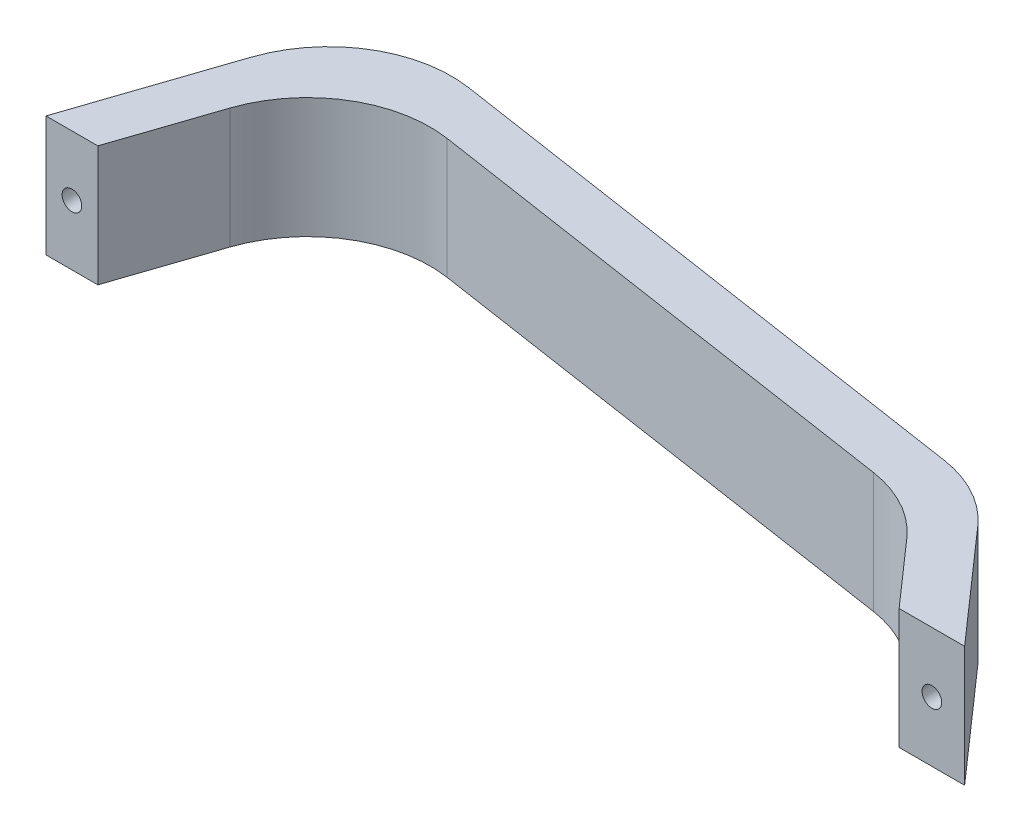
ISO-10303-21;
HEADER;
FILE_DESCRIPTION(('STEP AP214'),'2;1');
FILE_NAME('part.step','',(''),(''),'','','');
FILE_SCHEMA(('AUTOMOTIVE_DESIGN { 1 0 10303 214 1 1 1 1 }'));
ENDSEC;
DATA;
#1=APPLICATION_CONTEXT('core data for automotive mechanical design processes');
#2=APPLICATION_PROTOCOL_DEFINITION('international standard','automotive_design',2000,#1);
#3=PRODUCT_CONTEXT('',#1,'mechanical');
#4=PRODUCT('Part','Part','',(#3));
#5=PRODUCT_RELATED_PRODUCT_CATEGORY('part','',(#4));
#6=PRODUCT_DEFINITION_FORMATION('','',#4);
#7=PRODUCT_DEFINITION_CONTEXT('part definition',#1,'design');
#8=PRODUCT_DEFINITION('design','',#6,#7);
#9=PRODUCT_DEFINITION_SHAPE('','',#8);
#10=(LENGTH_UNIT() NAMED_UNIT(*) SI_UNIT(.MILLI.,.METRE.));
#11=(NAMED_UNIT(*) PLANE_ANGLE_UNIT() SI_UNIT($,.RADIAN.));
#12=(NAMED_UNIT(*) SI_UNIT($,.STERADIAN.) SOLID_ANGLE_UNIT());
#13=UNCERTAINTY_MEASURE_WITH_UNIT(LENGTH_MEASURE(1.E-05),#10,'distance_accuracy_value','');
#14=(GEOMETRIC_REPRESENTATION_CONTEXT(3) GLOBAL_UNCERTAINTY_ASSIGNED_CONTEXT((#13)) GLOBAL_UNIT_ASSIGNED_CONTEXT((#10,
#11,#12)) REPRESENTATION_CONTEXT('',''));
#15=CARTESIAN_POINT('',(0.,0.,0.));
#16=DIRECTION('',(0.,0.,1.));
#17=DIRECTION('',(1.,0.,0.));
#18=AXIS2_PLACEMENT_3D('',#15,#16,#17);
#19=CARTESIAN_POINT('',(-80.,24.5,0.));
#20=DIRECTION('',(0.,0.,-1.));
#21=DIRECTION('',(-1.,0.,0.));
#22=AXIS2_PLACEMENT_3D('',#19,#20,#21);
#23=PLANE('',#22);
#24=CARTESIAN_POINT('',(-85.2761085847183,12.25,0.));
#25=DIRECTION('',(0.,0.,1.));
#26=DIRECTION('',(1.,0.,0.));
#27=AXIS2_PLACEMENT_3D('',#24,#25,#26);
#28=CIRCLE('',#27,2.);
#29=CARTESIAN_POINT('',(-83.2761085847183,12.25,0.));
#30=VERTEX_POINT('',#29);
#31=EDGE_CURVE('E367',#30,#30,#28,.T.);
#32=ORIENTED_EDGE('',*,*,#31,.F.);
#33=EDGE_LOOP('',(#32));
#34=FACE_BOUND('',#33,.T.);
#35=DIRECTION('',(1.,0.,0.));
#36=VECTOR('',#35,1.);
#37=CARTESIAN_POINT('',(-80.,0.,0.));
#38=LINE('',#37,#36);
#39=CARTESIAN_POINT('',(-90.5522171694366,0.,0.));
#40=VERTEX_POINT('',#39);
#41=CARTESIAN_POINT('',(-80.,0.,0.));
#42=VERTEX_POINT('',#41);
#43=EDGE_CURVE('E142',#40,#42,#38,.T.);
#44=ORIENTED_EDGE('',*,*,#43,.T.);
#45=DIRECTION('',(0.,-1.,0.));
#46=VECTOR('',#45,1.);
#47=CARTESIAN_POINT('',(-80.,24.5,0.));
#48=LINE('',#47,#46);
#49=CARTESIAN_POINT('',(-80.,24.5,0.));
#50=VERTEX_POINT('',#49);
#51=EDGE_CURVE('E126',#50,#42,#48,.T.);
#52=ORIENTED_EDGE('',*,*,#51,.F.);
#53=DIRECTION('',(1.,0.,0.));
#54=VECTOR('',#53,1.);
#55=CARTESIAN_POINT('',(-80.,24.5,0.));
#56=LINE('',#55,#54);
#57=CARTESIAN_POINT('',(-90.5522171694366,24.5,0.));
#58=VERTEX_POINT('',#57);
#59=EDGE_CURVE('E130',#58,#50,#56,.T.);
#60=ORIENTED_EDGE('',*,*,#59,.F.);
#61=DIRECTION('',(0.,-1.,0.));
#62=VECTOR('',#61,1.);
#63=CARTESIAN_POINT('',(-90.5522171694366,24.5,0.));
#64=LINE('',#63,#62);
#65=EDGE_CURVE('E206',#58,#40,#64,.T.);
#66=ORIENTED_EDGE('',*,*,#65,.T.);
#67=EDGE_LOOP('',(#44,#52,#60,#66));
#68=FACE_BOUND('',#67,.T.);
#69=ADVANCED_FACE('F34',(#34,#68),#23,.F.);
#70=CARTESIAN_POINT('',(-80.,24.5,0.));
#71=DIRECTION('',(-0.947668138309732,0.,-0.319257105845064));
#72=DIRECTION('',(-0.319257105845064,0.,0.947668138309732));
#73=AXIS2_PLACEMENT_3D('',#70,#71,#72);
#74=PLANE('',#73);
#75=DIRECTION('',(0.319257105845064,0.,-0.947668138309732));
#76=VECTOR('',#75,1.);
#77=CARTESIAN_POINT('',(-80.,0.,0.));
#78=LINE('',#77,#76);
#79=CARTESIAN_POINT('',(-73.2217317390813,0.,-20.120300366646));
#80=VERTEX_POINT('',#79);
#81=EDGE_CURVE('E183',#42,#80,#78,.T.);
#82=ORIENTED_EDGE('',*,*,#81,.T.);
#83=DIRECTION('',(0.,-1.,0.));
#84=VECTOR('',#83,1.);
#85=CARTESIAN_POINT('',(-73.2217317390813,24.5,-20.120300366646));
#86=LINE('',#85,#84);
#87=CARTESIAN_POINT('',(-73.2217317390813,24.5,-20.120300366646));
#88=VERTEX_POINT('',#87);
#89=EDGE_CURVE('E57',#80,#88,#86,.F.);
#90=ORIENTED_EDGE('',*,*,#89,.T.);
#91=DIRECTION('',(0.319257105845064,0.,-0.947668138309732));
#92=VECTOR('',#91,1.);
#93=CARTESIAN_POINT('',(-80.,24.5,0.));
#94=LINE('',#93,#92);
#95=EDGE_CURVE('E122',#50,#88,#94,.T.);
#96=ORIENTED_EDGE('',*,*,#95,.F.);
#97=ORIENTED_EDGE('',*,*,#51,.T.);
#98=EDGE_LOOP('',(#82,#90,#96,#97));
#99=FACE_BOUND('',#98,.T.);
#100=ADVANCED_FACE('F124',(#99),#74,.F.);
#101=CARTESIAN_POINT('',(-66.5245187449483,24.5,-40.));
#102=DIRECTION('',(0.149846027789964,0.,-0.988709344527283));
#103=DIRECTION('',(-0.988709344527283,0.,-0.149846027789964));
#104=AXIS2_PLACEMENT_3D('',#101,#102,#103);
#105=PLANE('',#104);
#106=DIRECTION('',(0.988709344527283,0.,0.149846027789964));
#107=VECTOR('',#106,1.);
#108=CARTESIAN_POINT('',(-66.5245187449483,0.,-40.));
#109=LINE('',#108,#107);
#110=CARTESIAN_POINT('',(-45.7838775865889,0.,-36.8566063337015));
#111=VERTEX_POINT('',#110);
#112=CARTESIAN_POINT('',(56.4423325103516,0.,-21.3634873459643));
#113=VERTEX_POINT('',#112);
#114=EDGE_CURVE('E185',#111,#113,#109,.T.);
#115=ORIENTED_EDGE('',*,*,#114,.T.);
#116=DIRECTION('',(0.,-1.,0.));
#117=VECTOR('',#116,1.);
#118=CARTESIAN_POINT('',(56.4423325103517,24.5,-21.3634873459643));
#119=LINE('',#118,#117);
#120=CARTESIAN_POINT('',(56.4423325103516,24.5,-21.3634873459643));
#121=VERTEX_POINT('',#120);
#122=EDGE_CURVE('E156',#113,#121,#119,.F.);
#123=ORIENTED_EDGE('',*,*,#122,.T.);
#124=DIRECTION('',(0.988709344527283,0.,0.149846027789964));
#125=VECTOR('',#124,1.);
#126=CARTESIAN_POINT('',(-66.5245187449483,24.5,-40.));
#127=LINE('',#126,#125);
#128=CARTESIAN_POINT('',(-45.7838775865889,24.5,-36.8566063337015));
#129=VERTEX_POINT('',#128);
#130=EDGE_CURVE('E129',#129,#121,#127,.T.);
#131=ORIENTED_EDGE('',*,*,#130,.F.);
#132=DIRECTION('',(0.,-1.,0.));
#133=VECTOR('',#132,1.);
#134=CARTESIAN_POINT('',(-45.7838775865889,0.,-36.8566063337015));
#135=LINE('',#134,#133);
#136=EDGE_CURVE('E147',#129,#111,#135,.T.);
#137=ORIENTED_EDGE('',*,*,#136,.T.);
#138=EDGE_LOOP('',(#115,#123,#131,#137));
#139=FACE_BOUND('',#138,.T.);
#140=ADVANCED_FACE('F193',(#139),#105,.F.);
#141=CARTESIAN_POINT('',(65.4388518040712,24.5,-20.));
#142=DIRECTION('',(0.750318833155392,0.,-0.661076129210797));
#143=DIRECTION('',(-0.661076129210797,0.,-0.750318833155392));
#144=AXIS2_PLACEMENT_3D('',#141,#142,#143);
#145=PLANE('',#144);
#146=DIRECTION('',(0.661076129210797,0.,0.750318833155392));
#147=VECTOR('',#146,1.);
#148=CARTESIAN_POINT('',(65.4388518040712,24.5,-20.));
#149=LINE('',#148,#147);
#150=CARTESIAN_POINT('',(71.4541526444874,24.5,-13.1726569630522));
#151=VERTEX_POINT('',#150);
#152=CARTESIAN_POINT('',(83.0600576168243,24.5,0.));
#153=VERTEX_POINT('',#152);
#154=EDGE_CURVE('E195',#151,#153,#149,.T.);
#155=ORIENTED_EDGE('',*,*,#154,.F.);
#156=DIRECTION('',(0.,-1.,0.));
#157=VECTOR('',#156,1.);
#158=CARTESIAN_POINT('',(71.4541526444874,0.,-13.1726569630522));
#159=LINE('',#158,#157);
#160=CARTESIAN_POINT('',(71.4541526444874,0.,-13.1726569630522));
#161=VERTEX_POINT('',#160);
#162=EDGE_CURVE('E143',#151,#161,#159,.T.);
#163=ORIENTED_EDGE('',*,*,#162,.T.);
#164=DIRECTION('',(0.661076129210797,0.,0.750318833155392));
#165=VECTOR('',#164,1.);
#166=CARTESIAN_POINT('',(65.4388518040712,0.,-20.));
#167=LINE('',#166,#165);
#168=CARTESIAN_POINT('',(83.0600576168243,0.,0.));
#169=VERTEX_POINT('',#168);
#170=EDGE_CURVE('E210',#161,#169,#167,.T.);
#171=ORIENTED_EDGE('',*,*,#170,.T.);
#172=DIRECTION('',(0.,-1.,0.));
#173=VECTOR('',#172,1.);
#174=CARTESIAN_POINT('',(83.0600576168243,24.5,0.));
#175=LINE('',#174,#173);
#176=EDGE_CURVE('E144',#153,#169,#175,.T.);
#177=ORIENTED_EDGE('',*,*,#176,.F.);
#178=EDGE_LOOP('',(#155,#163,#171,#177));
#179=FACE_BOUND('',#178,.T.);
#180=ADVANCED_FACE('F327',(#179),#145,.F.);
#181=CARTESIAN_POINT('',(83.0600576168243,24.5,0.));
#182=DIRECTION('',(0.,0.,-1.));
#183=DIRECTION('',(-1.,0.,0.));
#184=AXIS2_PLACEMENT_3D('',#181,#182,#183);
#185=PLANE('',#184);
#186=CARTESIAN_POINT('',(89.7238914152817,12.25,0.));
#187=DIRECTION('',(0.,0.,1.));
#188=DIRECTION('',(1.,0.,0.));
#189=AXIS2_PLACEMENT_3D('',#186,#187,#188);
#190=CIRCLE('',#189,2.);
#191=CARTESIAN_POINT('',(91.7238914152817,12.25,0.));
#192=VERTEX_POINT('',#191);
#193=EDGE_CURVE('E368',#192,#192,#190,.T.);
#194=ORIENTED_EDGE('',*,*,#193,.F.);
#195=EDGE_LOOP('',(#194));
#196=FACE_BOUND('',#195,.T.);
#197=DIRECTION('',(1.,0.,0.));
#198=VECTOR('',#197,1.);
#199=CARTESIAN_POINT('',(83.0600576168243,0.,0.));
#200=LINE('',#199,#198);
#201=CARTESIAN_POINT('',(96.3877252137391,0.,0.));
#202=VERTEX_POINT('',#201);
#203=EDGE_CURVE('E212',#169,#202,#200,.T.);
#204=ORIENTED_EDGE('',*,*,#203,.T.);
#205=DIRECTION('',(0.,-1.,0.));
#206=VECTOR('',#205,1.);
#207=CARTESIAN_POINT('',(96.3877252137391,24.5,0.));
#208=LINE('',#207,#206);
#209=CARTESIAN_POINT('',(96.3877252137391,24.5,0.));
#210=VERTEX_POINT('',#209);
#211=EDGE_CURVE('E150',#210,#202,#208,.T.);
#212=ORIENTED_EDGE('',*,*,#211,.F.);
#213=DIRECTION('',(1.,0.,0.));
#214=VECTOR('',#213,1.);
#215=CARTESIAN_POINT('',(83.0600576168243,24.5,0.));
#216=LINE('',#215,#214);
#217=EDGE_CURVE('E197',#153,#210,#216,.T.);
#218=ORIENTED_EDGE('',*,*,#217,.F.);
#219=ORIENTED_EDGE('',*,*,#176,.T.);
#220=EDGE_LOOP('',(#204,#212,#218,#219));
#221=FACE_BOUND('',#220,.T.);
#222=ADVANCED_FACE('F230',(#196,#221),#185,.F.);
#223=CARTESIAN_POINT('',(70.5359197994586,24.5,-29.3416985068871));
#224=DIRECTION('',(-0.750318833155392,0.,0.661076129210798));
#225=DIRECTION('',(0.661076129210797,0.,0.750318833155392));
#226=AXIS2_PLACEMENT_3D('',#223,#224,#225);
#227=PLANE('',#226);
#228=DIRECTION('',(-0.661076129210797,0.,-0.750318833155392));
#229=VECTOR('',#228,1.);
#230=CARTESIAN_POINT('',(70.5359197994586,0.,-29.3416985068871));
#231=LINE('',#230,#229);
#232=CARTESIAN_POINT('',(76.5512206398748,0.,-22.5143554699393));
#233=VERTEX_POINT('',#232);
#234=EDGE_CURVE('E215',#202,#233,#231,.T.);
#235=ORIENTED_EDGE('',*,*,#234,.T.);
#236=DIRECTION('',(0.,-1.,0.));
#237=VECTOR('',#236,1.);
#238=CARTESIAN_POINT('',(76.5512206398748,24.5,-22.5143554699393));
#239=LINE('',#238,#237);
#240=CARTESIAN_POINT('',(76.5512206398748,24.5,-22.5143554699392));
#241=VERTEX_POINT('',#240);
#242=EDGE_CURVE('E167',#233,#241,#239,.F.);
#243=ORIENTED_EDGE('',*,*,#242,.T.);
#244=DIRECTION('',(-0.661076129210799,0.,-0.750318833155391));
#245=VECTOR('',#244,1.);
#246=CARTESIAN_POINT('',(90.5632459483782,24.5,-6.61076129210796));
#247=LINE('',#246,#245);
#248=EDGE_CURVE('E201',#210,#241,#247,.T.);
#249=ORIENTED_EDGE('',*,*,#248,.F.);
#250=ORIENTED_EDGE('',*,*,#211,.T.);
#251=EDGE_LOOP('',(#235,#243,#249,#250));
#252=FACE_BOUND('',#251,.T.);
#253=ADVANCED_FACE('F226',(#252),#227,.F.);
#254=CARTESIAN_POINT('',(-73.3223149303924,24.5,-51.1444509117922));
#255=DIRECTION('',(-0.149846027789964,0.,0.988709344527283));
#256=DIRECTION('',(0.988709344527283,0.,0.149846027789964));
#257=AXIS2_PLACEMENT_3D('',#254,#255,#256);
#258=PLANE('',#257);
#259=DIRECTION('',(-0.988709344527283,0.,-0.149846027789964));
#260=VECTOR('',#259,1.);
#261=CARTESIAN_POINT('',(-73.3223149303924,24.5,-51.1444509117922));
#262=LINE('',#261,#260);
#263=CARTESIAN_POINT('',(61.5394005057391,24.5,-30.7051858528514));
#264=VERTEX_POINT('',#263);
#265=CARTESIAN_POINT('',(-52.5816737720328,24.5,-48.0010572454937));
#266=VERTEX_POINT('',#265);
#267=EDGE_CURVE('E203',#264,#266,#262,.T.);
#268=ORIENTED_EDGE('',*,*,#267,.F.);
#269=DIRECTION('',(0.,-1.,0.));
#270=VECTOR('',#269,1.);
#271=CARTESIAN_POINT('',(61.5394005057391,24.5,-30.7051858528514));
#272=LINE('',#271,#270);
#273=CARTESIAN_POINT('',(61.5394005057391,0.,-30.7051858528514));
#274=VERTEX_POINT('',#273);
#275=EDGE_CURVE('E160',#264,#274,#272,.T.);
#276=ORIENTED_EDGE('',*,*,#275,.T.);
#277=DIRECTION('',(-0.988709344527283,0.,-0.149846027789964));
#278=VECTOR('',#277,1.);
#279=CARTESIAN_POINT('',(-73.3223149303924,0.,-51.1444509117922));
#280=LINE('',#279,#278);
#281=CARTESIAN_POINT('',(-52.5816737720328,0.,-48.0010572454937));
#282=VERTEX_POINT('',#281);
#283=EDGE_CURVE('E218',#274,#282,#280,.T.);
#284=ORIENTED_EDGE('',*,*,#283,.T.);
#285=DIRECTION('',(0.,-1.,0.));
#286=VECTOR('',#285,1.);
#287=CARTESIAN_POINT('',(-52.5816737720328,24.5,-48.0010572454937));
#288=LINE('',#287,#286);
#289=EDGE_CURVE('E158',#282,#266,#288,.F.);
#290=ORIENTED_EDGE('',*,*,#289,.T.);
#291=EDGE_LOOP('',(#268,#276,#284,#290));
#292=FACE_BOUND('',#291,.T.);
#293=ADVANCED_FACE('F240',(#292),#258,.F.);
#294=CARTESIAN_POINT('',(-89.4766813830973,24.5,-3.19257105845063));
#295=DIRECTION('',(0.94766813830973,0.,0.319257105845071));
#296=DIRECTION('',(0.319257105845071,0.,-0.94766813830973));
#297=AXIS2_PLACEMENT_3D('',#294,#295,#296);
#298=PLANE('',#297);
#299=DIRECTION('',(-0.319257105845063,0.,0.947668138309732));
#300=VECTOR('',#299,1.);
#301=CARTESIAN_POINT('',(-89.4766813830973,24.5,-3.19257105845063));
#302=LINE('',#301,#300);
#303=CARTESIAN_POINT('',(-80.0195279245253,24.5,-31.2647512784385));
#304=VERTEX_POINT('',#303);
#305=EDGE_CURVE('E135',#304,#58,#302,.T.);
#306=ORIENTED_EDGE('',*,*,#305,.F.);
#307=DIRECTION('',(0.,-1.,0.));
#308=VECTOR('',#307,1.);
#309=CARTESIAN_POINT('',(-80.0195279245251,24.5,-31.2647512784384));
#310=LINE('',#309,#308);
#311=CARTESIAN_POINT('',(-80.0195279245251,0.,-31.2647512784384));
#312=VERTEX_POINT('',#311);
#313=EDGE_CURVE('E172',#304,#312,#310,.T.);
#314=ORIENTED_EDGE('',*,*,#313,.T.);
#315=DIRECTION('',(-0.319257105845071,0.,0.94766813830973));
#316=VECTOR('',#315,1.);
#317=CARTESIAN_POINT('',(-89.4766813830973,0.,-3.19257105845063));
#318=LINE('',#317,#316);
#319=EDGE_CURVE('E139',#312,#40,#318,.T.);
#320=ORIENTED_EDGE('',*,*,#319,.T.);
#321=ORIENTED_EDGE('',*,*,#65,.F.);
#322=EDGE_LOOP('',(#306,#314,#320,#321));
#323=FACE_BOUND('',#322,.T.);
#324=ADVANCED_FACE('F247',(#323),#298,.F.);
#325=CARTESIAN_POINT('',(0.,24.5,0.));
#326=DIRECTION('',(0.,1.,0.));
#327=DIRECTION('',(0.,0.,1.));
#328=AXIS2_PLACEMENT_3D('',#325,#326,#327);
#329=PLANE('',#328);
#330=ORIENTED_EDGE('',*,*,#248,.T.);
#331=CARTESIAN_POINT('',(57.79324981099,24.5,-5.98745223966934));
#332=DIRECTION('',(0.,1.,0.));
#333=DIRECTION('',(0.,0.,1.));
#334=AXIS2_PLACEMENT_3D('',#331,#332,#333);
#335=CIRCLE('',#334,25.);
#336=EDGE_CURVE('E170',#241,#264,#335,.T.);
#337=ORIENTED_EDGE('',*,*,#336,.T.);
#338=ORIENTED_EDGE('',*,*,#267,.T.);
#339=CARTESIAN_POINT('',(-56.3278244667819,24.5,-23.2833236323116));
#340=DIRECTION('',(0.,1.,0.));
#341=DIRECTION('',(0.,0.,1.));
#342=AXIS2_PLACEMENT_3D('',#339,#340,#341);
#343=CIRCLE('',#342,25.);
#344=EDGE_CURVE('E49',#266,#304,#343,.T.);
#345=ORIENTED_EDGE('',*,*,#344,.T.);
#346=ORIENTED_EDGE('',*,*,#305,.T.);
#347=ORIENTED_EDGE('',*,*,#59,.T.);
#348=ORIENTED_EDGE('',*,*,#95,.T.);
#349=CARTESIAN_POINT('',(-49.530028281338,24.5,-12.1388727205194));
#350=DIRECTION('',(0.,1.,0.));
#351=DIRECTION('',(0.,0.,1.));
#352=AXIS2_PLACEMENT_3D('',#349,#350,#351);
#353=CIRCLE('',#352,25.);
#354=EDGE_CURVE('E11',#88,#129,#353,.F.);
#355=ORIENTED_EDGE('',*,*,#354,.T.);
#356=ORIENTED_EDGE('',*,*,#130,.T.);
#357=CARTESIAN_POINT('',(52.6961818156026,24.5,3.35424626721774));
#358=DIRECTION('',(0.,1.,0.));
#359=DIRECTION('',(0.,0.,1.));
#360=AXIS2_PLACEMENT_3D('',#357,#358,#359);
#361=CIRCLE('',#360,25.);
#362=EDGE_CURVE('E178',#121,#151,#361,.F.);
#363=ORIENTED_EDGE('',*,*,#362,.T.);
#364=ORIENTED_EDGE('',*,*,#154,.T.);
#365=ORIENTED_EDGE('',*,*,#217,.T.);
#366=EDGE_LOOP('',(#330,#337,#338,#345,#346,#347,#348,#355,#356,#363,#364,#365));
#367=FACE_BOUND('',#366,.T.);
#368=ADVANCED_FACE('F134',(#367),#329,.T.);
#369=CARTESIAN_POINT('',(0.,0.,0.));
#370=DIRECTION('',(0.,1.,0.));
#371=DIRECTION('',(0.,0.,1.));
#372=AXIS2_PLACEMENT_3D('',#369,#370,#371);
#373=PLANE('',#372);
#374=ORIENTED_EDGE('',*,*,#283,.F.);
#375=CARTESIAN_POINT('',(57.79324981099,0.,-5.98745223966934));
#376=DIRECTION('',(0.,1.,0.));
#377=DIRECTION('',(0.,0.,1.));
#378=AXIS2_PLACEMENT_3D('',#375,#376,#377);
#379=CIRCLE('',#378,25.);
#380=EDGE_CURVE('E165',#274,#233,#379,.F.);
#381=ORIENTED_EDGE('',*,*,#380,.T.);
#382=ORIENTED_EDGE('',*,*,#234,.F.);
#383=ORIENTED_EDGE('',*,*,#203,.F.);
#384=ORIENTED_EDGE('',*,*,#170,.F.);
#385=CARTESIAN_POINT('',(52.6961818156026,0.,3.35424626721774));
#386=DIRECTION('',(0.,1.,0.));
#387=DIRECTION('',(0.,0.,1.));
#388=AXIS2_PLACEMENT_3D('',#385,#386,#387);
#389=CIRCLE('',#388,25.);
#390=EDGE_CURVE('E176',#161,#113,#389,.T.);
#391=ORIENTED_EDGE('',*,*,#390,.T.);
#392=ORIENTED_EDGE('',*,*,#114,.F.);
#393=CARTESIAN_POINT('',(-49.530028281338,0.,-12.1388727205194));
#394=DIRECTION('',(0.,1.,0.));
#395=DIRECTION('',(0.,0.,1.));
#396=AXIS2_PLACEMENT_3D('',#393,#394,#395);
#397=CIRCLE('',#396,25.);
#398=EDGE_CURVE('E42',#111,#80,#397,.T.);
#399=ORIENTED_EDGE('',*,*,#398,.T.);
#400=ORIENTED_EDGE('',*,*,#81,.F.);
#401=ORIENTED_EDGE('',*,*,#43,.F.);
#402=ORIENTED_EDGE('',*,*,#319,.F.);
#403=CARTESIAN_POINT('',(-56.3278244667819,0.,-23.2833236323116));
#404=DIRECTION('',(0.,1.,0.));
#405=DIRECTION('',(0.,0.,1.));
#406=AXIS2_PLACEMENT_3D('',#403,#404,#405);
#407=CIRCLE('',#406,25.);
#408=EDGE_CURVE('E163',#312,#282,#407,.F.);
#409=ORIENTED_EDGE('',*,*,#408,.T.);
#410=EDGE_LOOP('',(#374,#381,#382,#383,#384,#391,#392,#399,#400,#401,#402,#409));
#411=FACE_BOUND('',#410,.T.);
#412=ADVANCED_FACE('F182',(#411),#373,.F.);
#413=CARTESIAN_POINT('',(52.6961818156026,24.5,3.35424626721774));
#414=DIRECTION('',(0.,1.,0.));
#415=DIRECTION('',(0.,0.,1.));
#416=AXIS2_PLACEMENT_3D('',#413,#414,#415);
#417=CYLINDRICAL_SURFACE('',#416,25.);
#418=ORIENTED_EDGE('',*,*,#362,.F.);
#419=ORIENTED_EDGE('',*,*,#122,.F.);
#420=ORIENTED_EDGE('',*,*,#390,.F.);
#421=ORIENTED_EDGE('',*,*,#162,.F.);
#422=EDGE_LOOP('',(#418,#419,#420,#421));
#423=FACE_BOUND('',#422,.T.);
#424=ADVANCED_FACE('F267',(#423),#417,.F.);
#425=CARTESIAN_POINT('',(57.79324981099,24.5,-5.98745223966934));
#426=DIRECTION('',(0.,-1.,0.));
#427=DIRECTION('',(0.,0.,-1.));
#428=AXIS2_PLACEMENT_3D('',#425,#426,#427);
#429=CYLINDRICAL_SURFACE('',#428,25.);
#430=ORIENTED_EDGE('',*,*,#336,.F.);
#431=ORIENTED_EDGE('',*,*,#242,.F.);
#432=ORIENTED_EDGE('',*,*,#380,.F.);
#433=ORIENTED_EDGE('',*,*,#275,.F.);
#434=EDGE_LOOP('',(#430,#431,#432,#433));
#435=FACE_BOUND('',#434,.T.);
#436=ADVANCED_FACE('F237',(#435),#429,.T.);
#437=CARTESIAN_POINT('',(-56.3278244667819,24.5,-23.2833236323116));
#438=DIRECTION('',(0.,-1.,0.));
#439=DIRECTION('',(0.,0.,-1.));
#440=AXIS2_PLACEMENT_3D('',#437,#438,#439);
#441=CYLINDRICAL_SURFACE('',#440,25.);
#442=ORIENTED_EDGE('',*,*,#344,.F.);
#443=ORIENTED_EDGE('',*,*,#289,.F.);
#444=ORIENTED_EDGE('',*,*,#408,.F.);
#445=ORIENTED_EDGE('',*,*,#313,.F.);
#446=EDGE_LOOP('',(#442,#443,#444,#445));
#447=FACE_BOUND('',#446,.T.);
#448=ADVANCED_FACE('F244',(#447),#441,.T.);
#449=CARTESIAN_POINT('',(-49.530028281338,24.5,-12.1388727205194));
#450=DIRECTION('',(0.,1.,0.));
#451=DIRECTION('',(0.,0.,1.));
#452=AXIS2_PLACEMENT_3D('',#449,#450,#451);
#453=CYLINDRICAL_SURFACE('',#452,25.);
#454=ORIENTED_EDGE('',*,*,#354,.F.);
#455=ORIENTED_EDGE('',*,*,#89,.F.);
#456=ORIENTED_EDGE('',*,*,#398,.F.);
#457=ORIENTED_EDGE('',*,*,#136,.F.);
#458=EDGE_LOOP('',(#454,#455,#456,#457));
#459=FACE_BOUND('',#458,.T.);
#460=ADVANCED_FACE('F36',(#459),#453,.F.);
#461=CARTESIAN_POINT('',(-85.2761085847183,12.25,-5.));
#462=DIRECTION('',(0.,0.,1.));
#463=DIRECTION('',(1.,0.,0.));
#464=AXIS2_PLACEMENT_3D('',#461,#462,#463);
#465=CYLINDRICAL_SURFACE('',#464,2.);
#466=CARTESIAN_POINT('',(-85.2761085847183,12.25,-5.));
#467=DIRECTION('',(0.,0.,1.));
#468=DIRECTION('',(1.,0.,0.));
#469=AXIS2_PLACEMENT_3D('',#466,#467,#468);
#470=CIRCLE('',#469,2.);
#471=CARTESIAN_POINT('',(-83.2761085847183,12.25,-5.));
#472=VERTEX_POINT('',#471);
#473=EDGE_CURVE('E207',#472,#472,#470,.T.);
#474=ORIENTED_EDGE('',*,*,#473,.F.);
#475=EDGE_LOOP('',(#474));
#476=FACE_BOUND('',#475,.T.);
#477=ORIENTED_EDGE('',*,*,#31,.T.);
#478=EDGE_LOOP('',(#477));
#479=FACE_BOUND('',#478,.T.);
#480=ADVANCED_FACE('F276',(#476,#479),#465,.F.);
#481=CARTESIAN_POINT('',(-85.2761085847183,12.25,-5.));
#482=DIRECTION('',(0.,0.,1.));
#483=DIRECTION('',(1.,0.,0.));
#484=AXIS2_PLACEMENT_3D('',#481,#482,#483);
#485=PLANE('',#484);
#486=ORIENTED_EDGE('',*,*,#473,.T.);
#487=EDGE_LOOP('',(#486));
#488=FACE_BOUND('',#487,.T.);
#489=ADVANCED_FACE('F280',(#488),#485,.T.);
#490=CARTESIAN_POINT('',(89.7238914152817,12.25,-5.));
#491=DIRECTION('',(0.,0.,1.));
#492=DIRECTION('',(1.,0.,0.));
#493=AXIS2_PLACEMENT_3D('',#490,#491,#492);
#494=CYLINDRICAL_SURFACE('',#493,2.);
#495=CARTESIAN_POINT('',(89.7238914152817,12.25,-5.));
#496=DIRECTION('',(0.,0.,1.));
#497=DIRECTION('',(1.,0.,0.));
#498=AXIS2_PLACEMENT_3D('',#495,#496,#497);
#499=CIRCLE('',#498,2.);
#500=CARTESIAN_POINT('',(91.7238914152817,12.25,-5.));
#501=VERTEX_POINT('',#500);
#502=EDGE_CURVE('E366',#501,#501,#499,.T.);
#503=ORIENTED_EDGE('',*,*,#502,.F.);
#504=EDGE_LOOP('',(#503));
#505=FACE_BOUND('',#504,.T.);
#506=ORIENTED_EDGE('',*,*,#193,.T.);
#507=EDGE_LOOP('',(#506));
#508=FACE_BOUND('',#507,.T.);
#509=ADVANCED_FACE('F286',(#505,#508),#494,.F.);
#510=CARTESIAN_POINT('',(89.7238914152817,12.25,-5.));
#511=DIRECTION('',(0.,0.,1.));
#512=DIRECTION('',(1.,0.,0.));
#513=AXIS2_PLACEMENT_3D('',#510,#511,#512);
#514=PLANE('',#513);
#515=ORIENTED_EDGE('',*,*,#502,.T.);
#516=EDGE_LOOP('',(#515));
#517=FACE_BOUND('',#516,.T.);
#518=ADVANCED_FACE('F351',(#517),#514,.T.);
#519=CLOSED_SHELL('',(#69,#100,#140,#180,#222,#253,#293,#324,#368,#412,#424,#436,#448,#460,#480,
#489,#509,#518));
#520=MANIFOLD_SOLID_BREP('B2',#519);
#521=ADVANCED_BREP_SHAPE_REPRESENTATION('',(#18,#520),#14);
#522=SHAPE_DEFINITION_REPRESENTATION(#9,#521);
ENDSEC;
END-ISO-10303-21;
